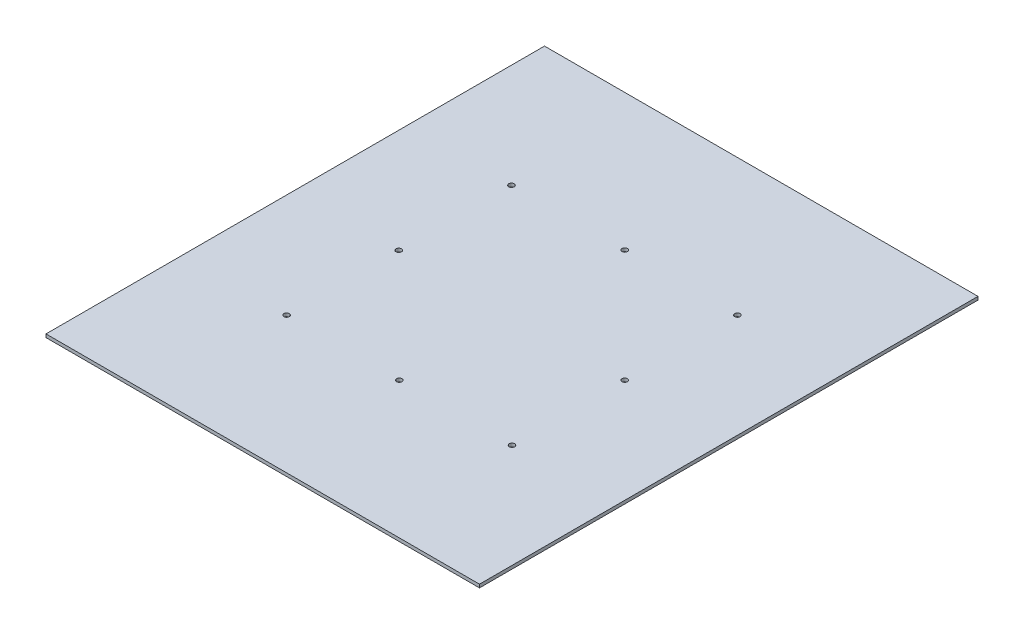
ISO-10303-21;
HEADER;
FILE_DESCRIPTION(('STEP AP214'),'2;1');
FILE_NAME('part.step','',(''),(''),'','','');
FILE_SCHEMA(('AUTOMOTIVE_DESIGN { 1 0 10303 214 1 1 1 1 }'));
ENDSEC;
DATA;
#1=APPLICATION_CONTEXT('core data for automotive mechanical design processes');
#2=APPLICATION_PROTOCOL_DEFINITION('international standard','automotive_design',2000,#1);
#3=PRODUCT_CONTEXT('',#1,'mechanical');
#4=PRODUCT('Part','Part','',(#3));
#5=PRODUCT_RELATED_PRODUCT_CATEGORY('part','',(#4));
#6=PRODUCT_DEFINITION_FORMATION('','',#4);
#7=PRODUCT_DEFINITION_CONTEXT('part definition',#1,'design');
#8=PRODUCT_DEFINITION('design','',#6,#7);
#9=PRODUCT_DEFINITION_SHAPE('','',#8);
#10=(LENGTH_UNIT() NAMED_UNIT(*) SI_UNIT(.MILLI.,.METRE.));
#11=(NAMED_UNIT(*) PLANE_ANGLE_UNIT() SI_UNIT($,.RADIAN.));
#12=(NAMED_UNIT(*) SI_UNIT($,.STERADIAN.) SOLID_ANGLE_UNIT());
#13=UNCERTAINTY_MEASURE_WITH_UNIT(LENGTH_MEASURE(1.E-05),#10,'distance_accuracy_value','');
#14=(GEOMETRIC_REPRESENTATION_CONTEXT(3) GLOBAL_UNCERTAINTY_ASSIGNED_CONTEXT((#13)) GLOBAL_UNIT_ASSIGNED_CONTEXT((#10,
#11,#12)) REPRESENTATION_CONTEXT('',''));
#15=CARTESIAN_POINT('',(0.,0.,0.));
#16=DIRECTION('',(0.,0.,1.));
#17=DIRECTION('',(1.,0.,0.));
#18=AXIS2_PLACEMENT_3D('',#15,#16,#17);
#19=CARTESIAN_POINT('',(0.,3.,0.));
#20=DIRECTION('',(0.,-1.,0.));
#21=DIRECTION('',(0.,0.,-1.));
#22=AXIS2_PLACEMENT_3D('',#19,#20,#21);
#23=PLANE('',#22);
#24=CARTESIAN_POINT('',(303.999399037589,3.,-230.000000001736));
#25=DIRECTION('',(0.,1.,0.));
#26=DIRECTION('',(0.,0.,1.));
#27=AXIS2_PLACEMENT_3D('',#24,#25,#26);
#28=CIRCLE('',#27,2.50000000000002);
#29=CARTESIAN_POINT('',(303.999399037589,3.,-227.500000001736));
#30=VERTEX_POINT('',#29);
#31=EDGE_CURVE('E145',#30,#30,#28,.T.);
#32=ORIENTED_EDGE('',*,*,#31,.F.);
#33=EDGE_LOOP('',(#32));
#34=FACE_BOUND('',#33,.T.);
#35=CARTESIAN_POINT('',(200.,3.,-126.));
#36=DIRECTION('',(0.,1.,0.));
#37=DIRECTION('',(0.,0.,1.));
#38=AXIS2_PLACEMENT_3D('',#35,#36,#37);
#39=CIRCLE('',#38,2.5);
#40=CARTESIAN_POINT('',(200.,3.,-123.5));
#41=VERTEX_POINT('',#40);
#42=EDGE_CURVE('E133',#41,#41,#39,.T.);
#43=ORIENTED_EDGE('',*,*,#42,.F.);
#44=EDGE_LOOP('',(#43));
#45=FACE_BOUND('',#44,.T.);
#46=CARTESIAN_POINT('',(304.,3.,-334.));
#47=DIRECTION('',(0.,1.,0.));
#48=DIRECTION('',(0.,0.,1.));
#49=AXIS2_PLACEMENT_3D('',#46,#47,#48);
#50=CIRCLE('',#49,2.50000000000002);
#51=CARTESIAN_POINT('',(304.,3.,-331.5));
#52=VERTEX_POINT('',#51);
#53=EDGE_CURVE('E121',#52,#52,#50,.T.);
#54=ORIENTED_EDGE('',*,*,#53,.F.);
#55=EDGE_LOOP('',(#54));
#56=FACE_BOUND('',#55,.T.);
#57=CARTESIAN_POINT('',(96.0000000000001,3.,-126.));
#58=DIRECTION('',(0.,1.,0.));
#59=DIRECTION('',(0.,0.,1.));
#60=AXIS2_PLACEMENT_3D('',#57,#58,#59);
#61=CIRCLE('',#60,2.5);
#62=CARTESIAN_POINT('',(96.0000000000001,3.,-123.5));
#63=VERTEX_POINT('',#62);
#64=EDGE_CURVE('E100',#63,#63,#61,.T.);
#65=ORIENTED_EDGE('',*,*,#64,.F.);
#66=EDGE_LOOP('',(#65));
#67=FACE_BOUND('',#66,.T.);
#68=DIRECTION('',(0.,0.,1.));
#69=VECTOR('',#68,1.);
#70=CARTESIAN_POINT('',(0.,3.,0.));
#71=LINE('',#70,#69);
#72=CARTESIAN_POINT('',(0.,3.,-460.));
#73=VERTEX_POINT('',#72);
#74=CARTESIAN_POINT('',(0.,3.,0.));
#75=VERTEX_POINT('',#74);
#76=EDGE_CURVE('E85',#73,#75,#71,.T.);
#77=ORIENTED_EDGE('',*,*,#76,.T.);
#78=DIRECTION('',(1.,0.,0.));
#79=VECTOR('',#78,1.);
#80=CARTESIAN_POINT('',(0.,3.,0.));
#81=LINE('',#80,#79);
#82=CARTESIAN_POINT('',(400.,3.,0.));
#83=VERTEX_POINT('',#82);
#84=EDGE_CURVE('E80',#75,#83,#81,.T.);
#85=ORIENTED_EDGE('',*,*,#84,.T.);
#86=DIRECTION('',(0.,0.,-1.));
#87=VECTOR('',#86,1.);
#88=CARTESIAN_POINT('',(400.,3.,0.));
#89=LINE('',#88,#87);
#90=CARTESIAN_POINT('',(400.,3.,-460.));
#91=VERTEX_POINT('',#90);
#92=EDGE_CURVE('E83',#83,#91,#89,.T.);
#93=ORIENTED_EDGE('',*,*,#92,.T.);
#94=DIRECTION('',(-1.,0.,0.));
#95=VECTOR('',#94,1.);
#96=CARTESIAN_POINT('',(0.,3.,-460.));
#97=LINE('',#96,#95);
#98=EDGE_CURVE('E50',#91,#73,#97,.T.);
#99=ORIENTED_EDGE('',*,*,#98,.T.);
#100=EDGE_LOOP('',(#77,#85,#93,#99));
#101=FACE_BOUND('',#100,.T.);
#102=CARTESIAN_POINT('',(96.,3.,-333.5));
#103=DIRECTION('',(0.,1.,0.));
#104=DIRECTION('',(0.,0.,1.));
#105=AXIS2_PLACEMENT_3D('',#102,#103,#104);
#106=CIRCLE('',#105,2.5);
#107=CARTESIAN_POINT('',(96.,3.,-331.));
#108=VERTEX_POINT('',#107);
#109=EDGE_CURVE('E115',#108,#108,#106,.T.);
#110=ORIENTED_EDGE('',*,*,#109,.F.);
#111=EDGE_LOOP('',(#110));
#112=FACE_BOUND('',#111,.T.);
#113=CARTESIAN_POINT('',(304.,3.,-126.));
#114=DIRECTION('',(0.,1.,0.));
#115=DIRECTION('',(0.,0.,1.));
#116=AXIS2_PLACEMENT_3D('',#113,#114,#115);
#117=CIRCLE('',#116,2.50000000000002);
#118=CARTESIAN_POINT('',(304.,3.,-123.5));
#119=VERTEX_POINT('',#118);
#120=EDGE_CURVE('E127',#119,#119,#117,.T.);
#121=ORIENTED_EDGE('',*,*,#120,.F.);
#122=EDGE_LOOP('',(#121));
#123=FACE_BOUND('',#122,.T.);
#124=CARTESIAN_POINT('',(200.,3.,-334.));
#125=DIRECTION('',(0.,1.,0.));
#126=DIRECTION('',(0.,0.,1.));
#127=AXIS2_PLACEMENT_3D('',#124,#125,#126);
#128=CIRCLE('',#127,2.5);
#129=CARTESIAN_POINT('',(200.,3.,-331.5));
#130=VERTEX_POINT('',#129);
#131=EDGE_CURVE('E139',#130,#130,#128,.T.);
#132=ORIENTED_EDGE('',*,*,#131,.F.);
#133=EDGE_LOOP('',(#132));
#134=FACE_BOUND('',#133,.T.);
#135=CARTESIAN_POINT('',(96.,3.,-229.5));
#136=DIRECTION('',(0.,1.,0.));
#137=DIRECTION('',(0.,0.,1.));
#138=AXIS2_PLACEMENT_3D('',#135,#136,#137);
#139=CIRCLE('',#138,2.5);
#140=CARTESIAN_POINT('',(96.,3.,-227.));
#141=VERTEX_POINT('',#140);
#142=EDGE_CURVE('E151',#141,#141,#139,.T.);
#143=ORIENTED_EDGE('',*,*,#142,.F.);
#144=EDGE_LOOP('',(#143));
#145=FACE_BOUND('',#144,.T.);
#146=ADVANCED_FACE('F33',(#34,#45,#56,#67,#101,#112,#123,#134,#145),#23,.F.);
#147=CARTESIAN_POINT('',(0.,0.,0.));
#148=DIRECTION('',(0.,-1.,0.));
#149=DIRECTION('',(0.,0.,-1.));
#150=AXIS2_PLACEMENT_3D('',#147,#148,#149);
#151=PLANE('',#150);
#152=CARTESIAN_POINT('',(303.999399037589,0.,-230.000000001736));
#153=DIRECTION('',(0.,1.,0.));
#154=DIRECTION('',(0.,0.,1.));
#155=AXIS2_PLACEMENT_3D('',#152,#153,#154);
#156=CIRCLE('',#155,2.50000000000002);
#157=CARTESIAN_POINT('',(303.999399037589,0.,-227.500000001736));
#158=VERTEX_POINT('',#157);
#159=EDGE_CURVE('E148',#158,#158,#156,.T.);
#160=ORIENTED_EDGE('',*,*,#159,.T.);
#161=EDGE_LOOP('',(#160));
#162=FACE_BOUND('',#161,.T.);
#163=CARTESIAN_POINT('',(200.,0.,-126.));
#164=DIRECTION('',(0.,1.,0.));
#165=DIRECTION('',(0.,0.,1.));
#166=AXIS2_PLACEMENT_3D('',#163,#164,#165);
#167=CIRCLE('',#166,2.5);
#168=CARTESIAN_POINT('',(200.,0.,-123.5));
#169=VERTEX_POINT('',#168);
#170=EDGE_CURVE('E136',#169,#169,#167,.T.);
#171=ORIENTED_EDGE('',*,*,#170,.T.);
#172=EDGE_LOOP('',(#171));
#173=FACE_BOUND('',#172,.T.);
#174=CARTESIAN_POINT('',(304.,0.,-334.));
#175=DIRECTION('',(0.,1.,0.));
#176=DIRECTION('',(0.,0.,1.));
#177=AXIS2_PLACEMENT_3D('',#174,#175,#176);
#178=CIRCLE('',#177,2.50000000000002);
#179=CARTESIAN_POINT('',(304.,0.,-331.5));
#180=VERTEX_POINT('',#179);
#181=EDGE_CURVE('E124',#180,#180,#178,.T.);
#182=ORIENTED_EDGE('',*,*,#181,.T.);
#183=EDGE_LOOP('',(#182));
#184=FACE_BOUND('',#183,.T.);
#185=CARTESIAN_POINT('',(96.0000000000001,0.,-126.));
#186=DIRECTION('',(0.,1.,0.));
#187=DIRECTION('',(0.,0.,1.));
#188=AXIS2_PLACEMENT_3D('',#185,#186,#187);
#189=CIRCLE('',#188,2.5);
#190=CARTESIAN_POINT('',(96.0000000000001,0.,-123.5));
#191=VERTEX_POINT('',#190);
#192=EDGE_CURVE('E112',#191,#191,#189,.T.);
#193=ORIENTED_EDGE('',*,*,#192,.T.);
#194=EDGE_LOOP('',(#193));
#195=FACE_BOUND('',#194,.T.);
#196=DIRECTION('',(0.,0.,1.));
#197=VECTOR('',#196,1.);
#198=CARTESIAN_POINT('',(0.,0.,0.));
#199=LINE('',#198,#197);
#200=CARTESIAN_POINT('',(0.,0.,-460.));
#201=VERTEX_POINT('',#200);
#202=CARTESIAN_POINT('',(0.,0.,0.));
#203=VERTEX_POINT('',#202);
#204=EDGE_CURVE('E97',#201,#203,#199,.T.);
#205=ORIENTED_EDGE('',*,*,#204,.F.);
#206=DIRECTION('',(-1.,0.,0.));
#207=VECTOR('',#206,1.);
#208=CARTESIAN_POINT('',(0.,0.,-460.));
#209=LINE('',#208,#207);
#210=CARTESIAN_POINT('',(400.,0.,-460.));
#211=VERTEX_POINT('',#210);
#212=EDGE_CURVE('E73',#211,#201,#209,.T.);
#213=ORIENTED_EDGE('',*,*,#212,.F.);
#214=DIRECTION('',(0.,0.,-1.));
#215=VECTOR('',#214,1.);
#216=CARTESIAN_POINT('',(400.,0.,0.));
#217=LINE('',#216,#215);
#218=CARTESIAN_POINT('',(400.,0.,0.));
#219=VERTEX_POINT('',#218);
#220=EDGE_CURVE('E67',#219,#211,#217,.T.);
#221=ORIENTED_EDGE('',*,*,#220,.F.);
#222=DIRECTION('',(1.,0.,0.));
#223=VECTOR('',#222,1.);
#224=CARTESIAN_POINT('',(0.,0.,0.));
#225=LINE('',#224,#223);
#226=EDGE_CURVE('E89',#203,#219,#225,.T.);
#227=ORIENTED_EDGE('',*,*,#226,.F.);
#228=EDGE_LOOP('',(#205,#213,#221,#227));
#229=FACE_BOUND('',#228,.T.);
#230=CARTESIAN_POINT('',(96.,0.,-333.5));
#231=DIRECTION('',(0.,1.,0.));
#232=DIRECTION('',(0.,0.,1.));
#233=AXIS2_PLACEMENT_3D('',#230,#231,#232);
#234=CIRCLE('',#233,2.5);
#235=CARTESIAN_POINT('',(96.,0.,-331.));
#236=VERTEX_POINT('',#235);
#237=EDGE_CURVE('E118',#236,#236,#234,.T.);
#238=ORIENTED_EDGE('',*,*,#237,.T.);
#239=EDGE_LOOP('',(#238));
#240=FACE_BOUND('',#239,.T.);
#241=CARTESIAN_POINT('',(304.,0.,-126.));
#242=DIRECTION('',(0.,1.,0.));
#243=DIRECTION('',(0.,0.,1.));
#244=AXIS2_PLACEMENT_3D('',#241,#242,#243);
#245=CIRCLE('',#244,2.50000000000002);
#246=CARTESIAN_POINT('',(304.,0.,-123.5));
#247=VERTEX_POINT('',#246);
#248=EDGE_CURVE('E130',#247,#247,#245,.T.);
#249=ORIENTED_EDGE('',*,*,#248,.T.);
#250=EDGE_LOOP('',(#249));
#251=FACE_BOUND('',#250,.T.);
#252=CARTESIAN_POINT('',(200.,0.,-334.));
#253=DIRECTION('',(0.,1.,0.));
#254=DIRECTION('',(0.,0.,1.));
#255=AXIS2_PLACEMENT_3D('',#252,#253,#254);
#256=CIRCLE('',#255,2.5);
#257=CARTESIAN_POINT('',(200.,0.,-331.5));
#258=VERTEX_POINT('',#257);
#259=EDGE_CURVE('E142',#258,#258,#256,.T.);
#260=ORIENTED_EDGE('',*,*,#259,.T.);
#261=EDGE_LOOP('',(#260));
#262=FACE_BOUND('',#261,.T.);
#263=CARTESIAN_POINT('',(96.,0.,-229.5));
#264=DIRECTION('',(0.,1.,0.));
#265=DIRECTION('',(0.,0.,1.));
#266=AXIS2_PLACEMENT_3D('',#263,#264,#265);
#267=CIRCLE('',#266,2.5);
#268=CARTESIAN_POINT('',(96.,0.,-227.));
#269=VERTEX_POINT('',#268);
#270=EDGE_CURVE('E154',#269,#269,#267,.T.);
#271=ORIENTED_EDGE('',*,*,#270,.T.);
#272=EDGE_LOOP('',(#271));
#273=FACE_BOUND('',#272,.T.);
#274=ADVANCED_FACE('F108',(#162,#173,#184,#195,#229,#240,#251,#262,#273),#151,.T.);
#275=CARTESIAN_POINT('',(0.,3.,0.));
#276=DIRECTION('',(1.,0.,0.));
#277=DIRECTION('',(0.,0.,-1.));
#278=AXIS2_PLACEMENT_3D('',#275,#276,#277);
#279=PLANE('',#278);
#280=ORIENTED_EDGE('',*,*,#204,.T.);
#281=DIRECTION('',(0.,-1.,0.));
#282=VECTOR('',#281,1.);
#283=CARTESIAN_POINT('',(0.,3.,0.));
#284=LINE('',#283,#282);
#285=EDGE_CURVE('E11',#75,#203,#284,.T.);
#286=ORIENTED_EDGE('',*,*,#285,.F.);
#287=ORIENTED_EDGE('',*,*,#76,.F.);
#288=DIRECTION('',(0.,-1.,0.));
#289=VECTOR('',#288,1.);
#290=CARTESIAN_POINT('',(0.,3.,-460.));
#291=LINE('',#290,#289);
#292=EDGE_CURVE('E93',#73,#201,#291,.T.);
#293=ORIENTED_EDGE('',*,*,#292,.T.);
#294=EDGE_LOOP('',(#280,#286,#287,#293));
#295=FACE_BOUND('',#294,.T.);
#296=ADVANCED_FACE('F35',(#295),#279,.F.);
#297=CARTESIAN_POINT('',(0.,3.,0.));
#298=DIRECTION('',(0.,0.,-1.));
#299=DIRECTION('',(-1.,0.,0.));
#300=AXIS2_PLACEMENT_3D('',#297,#298,#299);
#301=PLANE('',#300);
#302=ORIENTED_EDGE('',*,*,#226,.T.);
#303=DIRECTION('',(0.,-1.,0.));
#304=VECTOR('',#303,1.);
#305=CARTESIAN_POINT('',(400.,3.,0.));
#306=LINE('',#305,#304);
#307=EDGE_CURVE('E42',#83,#219,#306,.T.);
#308=ORIENTED_EDGE('',*,*,#307,.F.);
#309=ORIENTED_EDGE('',*,*,#84,.F.);
#310=ORIENTED_EDGE('',*,*,#285,.T.);
#311=EDGE_LOOP('',(#302,#308,#309,#310));
#312=FACE_BOUND('',#311,.T.);
#313=ADVANCED_FACE('F88',(#312),#301,.F.);
#314=CARTESIAN_POINT('',(400.,3.,0.));
#315=DIRECTION('',(-1.,0.,0.));
#316=DIRECTION('',(0.,0.,1.));
#317=AXIS2_PLACEMENT_3D('',#314,#315,#316);
#318=PLANE('',#317);
#319=ORIENTED_EDGE('',*,*,#220,.T.);
#320=DIRECTION('',(0.,-1.,0.));
#321=VECTOR('',#320,1.);
#322=CARTESIAN_POINT('',(400.,3.,-460.));
#323=LINE('',#322,#321);
#324=EDGE_CURVE('E90',#91,#211,#323,.T.);
#325=ORIENTED_EDGE('',*,*,#324,.F.);
#326=ORIENTED_EDGE('',*,*,#92,.F.);
#327=ORIENTED_EDGE('',*,*,#307,.T.);
#328=EDGE_LOOP('',(#319,#325,#326,#327));
#329=FACE_BOUND('',#328,.T.);
#330=ADVANCED_FACE('F91',(#329),#318,.F.);
#331=CARTESIAN_POINT('',(0.,3.,-460.));
#332=DIRECTION('',(0.,0.,1.));
#333=DIRECTION('',(1.,0.,0.));
#334=AXIS2_PLACEMENT_3D('',#331,#332,#333);
#335=PLANE('',#334);
#336=ORIENTED_EDGE('',*,*,#212,.T.);
#337=ORIENTED_EDGE('',*,*,#292,.F.);
#338=ORIENTED_EDGE('',*,*,#98,.F.);
#339=ORIENTED_EDGE('',*,*,#324,.T.);
#340=EDGE_LOOP('',(#336,#337,#338,#339));
#341=FACE_BOUND('',#340,.T.);
#342=ADVANCED_FACE('F105',(#341),#335,.F.);
#343=CARTESIAN_POINT('',(96.0000000000001,3.,-126.));
#344=DIRECTION('',(0.,-1.,0.));
#345=DIRECTION('',(0.,0.,-1.));
#346=AXIS2_PLACEMENT_3D('',#343,#344,#345);
#347=CYLINDRICAL_SURFACE('',#346,2.5);
#348=ORIENTED_EDGE('',*,*,#64,.T.);
#349=EDGE_LOOP('',(#348));
#350=FACE_BOUND('',#349,.T.);
#351=ORIENTED_EDGE('',*,*,#192,.F.);
#352=EDGE_LOOP('',(#351));
#353=FACE_BOUND('',#352,.T.);
#354=ADVANCED_FACE('F174',(#350,#353),#347,.F.);
#355=CARTESIAN_POINT('',(96.,3.,-333.5));
#356=DIRECTION('',(0.,-1.,0.));
#357=DIRECTION('',(0.,0.,-1.));
#358=AXIS2_PLACEMENT_3D('',#355,#356,#357);
#359=CYLINDRICAL_SURFACE('',#358,2.5);
#360=ORIENTED_EDGE('',*,*,#109,.T.);
#361=EDGE_LOOP('',(#360));
#362=FACE_BOUND('',#361,.T.);
#363=ORIENTED_EDGE('',*,*,#237,.F.);
#364=EDGE_LOOP('',(#363));
#365=FACE_BOUND('',#364,.T.);
#366=ADVANCED_FACE('F220',(#362,#365),#359,.F.);
#367=CARTESIAN_POINT('',(304.,3.,-334.));
#368=DIRECTION('',(0.,-1.,0.));
#369=DIRECTION('',(0.,0.,-1.));
#370=AXIS2_PLACEMENT_3D('',#367,#368,#369);
#371=CYLINDRICAL_SURFACE('',#370,2.50000000000002);
#372=ORIENTED_EDGE('',*,*,#53,.T.);
#373=EDGE_LOOP('',(#372));
#374=FACE_BOUND('',#373,.T.);
#375=ORIENTED_EDGE('',*,*,#181,.F.);
#376=EDGE_LOOP('',(#375));
#377=FACE_BOUND('',#376,.T.);
#378=ADVANCED_FACE('F228',(#374,#377),#371,.F.);
#379=CARTESIAN_POINT('',(304.,3.,-126.));
#380=DIRECTION('',(0.,-1.,0.));
#381=DIRECTION('',(0.,0.,-1.));
#382=AXIS2_PLACEMENT_3D('',#379,#380,#381);
#383=CYLINDRICAL_SURFACE('',#382,2.50000000000002);
#384=ORIENTED_EDGE('',*,*,#120,.T.);
#385=EDGE_LOOP('',(#384));
#386=FACE_BOUND('',#385,.T.);
#387=ORIENTED_EDGE('',*,*,#248,.F.);
#388=EDGE_LOOP('',(#387));
#389=FACE_BOUND('',#388,.T.);
#390=ADVANCED_FACE('F236',(#386,#389),#383,.F.);
#391=CARTESIAN_POINT('',(200.,3.,-126.));
#392=DIRECTION('',(0.,-1.,0.));
#393=DIRECTION('',(0.,0.,-1.));
#394=AXIS2_PLACEMENT_3D('',#391,#392,#393);
#395=CYLINDRICAL_SURFACE('',#394,2.5);
#396=ORIENTED_EDGE('',*,*,#42,.T.);
#397=EDGE_LOOP('',(#396));
#398=FACE_BOUND('',#397,.T.);
#399=ORIENTED_EDGE('',*,*,#170,.F.);
#400=EDGE_LOOP('',(#399));
#401=FACE_BOUND('',#400,.T.);
#402=ADVANCED_FACE('F245',(#398,#401),#395,.F.);
#403=CARTESIAN_POINT('',(200.,3.,-334.));
#404=DIRECTION('',(0.,-1.,0.));
#405=DIRECTION('',(0.,0.,-1.));
#406=AXIS2_PLACEMENT_3D('',#403,#404,#405);
#407=CYLINDRICAL_SURFACE('',#406,2.5);
#408=ORIENTED_EDGE('',*,*,#131,.T.);
#409=EDGE_LOOP('',(#408));
#410=FACE_BOUND('',#409,.T.);
#411=ORIENTED_EDGE('',*,*,#259,.F.);
#412=EDGE_LOOP('',(#411));
#413=FACE_BOUND('',#412,.T.);
#414=ADVANCED_FACE('F254',(#410,#413),#407,.F.);
#415=CARTESIAN_POINT('',(303.999399037589,3.,-230.000000001736));
#416=DIRECTION('',(0.,-1.,0.));
#417=DIRECTION('',(0.,0.,-1.));
#418=AXIS2_PLACEMENT_3D('',#415,#416,#417);
#419=CYLINDRICAL_SURFACE('',#418,2.50000000000002);
#420=ORIENTED_EDGE('',*,*,#31,.T.);
#421=EDGE_LOOP('',(#420));
#422=FACE_BOUND('',#421,.T.);
#423=ORIENTED_EDGE('',*,*,#159,.F.);
#424=EDGE_LOOP('',(#423));
#425=FACE_BOUND('',#424,.T.);
#426=ADVANCED_FACE('F263',(#422,#425),#419,.F.);
#427=CARTESIAN_POINT('',(96.,3.,-229.5));
#428=DIRECTION('',(0.,-1.,0.));
#429=DIRECTION('',(0.,0.,-1.));
#430=AXIS2_PLACEMENT_3D('',#427,#428,#429);
#431=CYLINDRICAL_SURFACE('',#430,2.5);
#432=ORIENTED_EDGE('',*,*,#142,.T.);
#433=EDGE_LOOP('',(#432));
#434=FACE_BOUND('',#433,.T.);
#435=ORIENTED_EDGE('',*,*,#270,.F.);
#436=EDGE_LOOP('',(#435));
#437=FACE_BOUND('',#436,.T.);
#438=ADVANCED_FACE('F160',(#434,#437),#431,.F.);
#439=CLOSED_SHELL('',(#146,#274,#296,#313,#330,#342,#354,#366,#378,#390,#402,#414,#426,#438));
#440=MANIFOLD_SOLID_BREP('B2',#439);
#441=ADVANCED_BREP_SHAPE_REPRESENTATION('',(#18,#440),#14);
#442=SHAPE_DEFINITION_REPRESENTATION(#9,#441);
ENDSEC;
END-ISO-10303-21;
